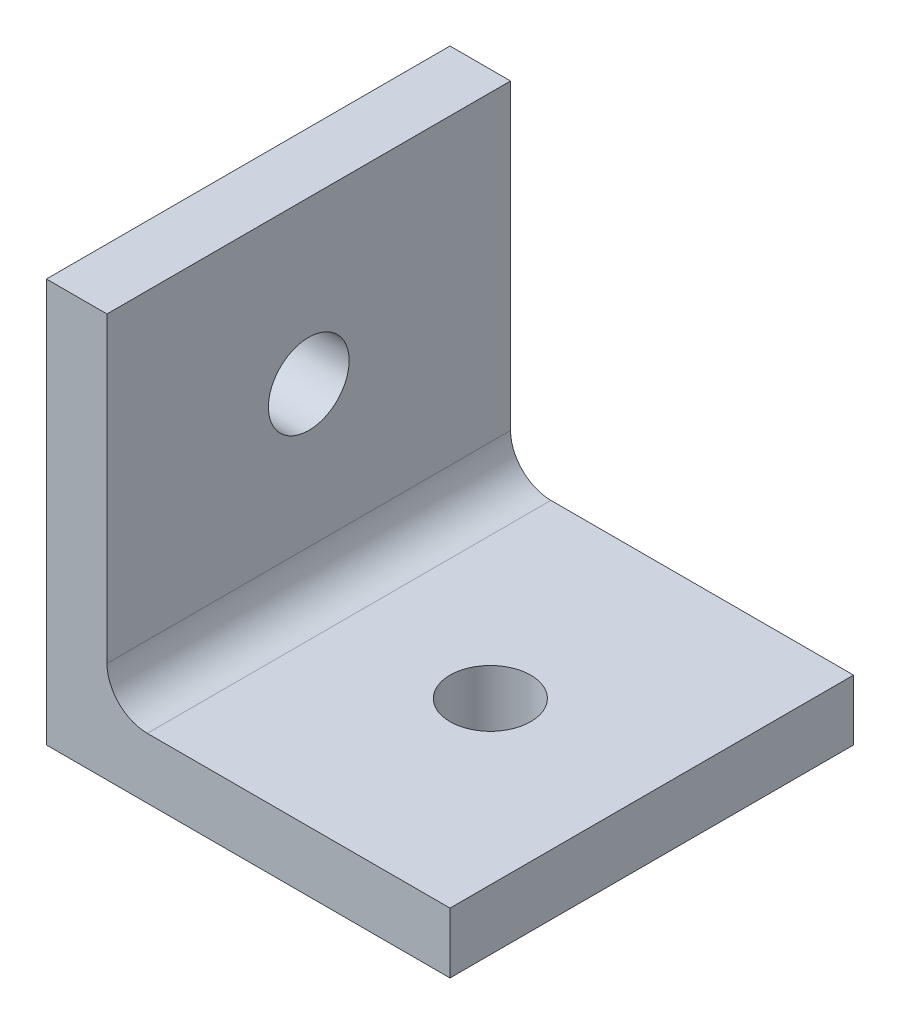
ISO-10303-21;
HEADER;
FILE_DESCRIPTION(('STEP AP214'),'2;1');
FILE_NAME('part.step','',(''),(''),'','','');
FILE_SCHEMA(('AUTOMOTIVE_DESIGN { 1 0 10303 214 1 1 1 1 }'));
ENDSEC;
DATA;
#1=APPLICATION_CONTEXT('core data for automotive mechanical design processes');
#2=APPLICATION_PROTOCOL_DEFINITION('international standard','automotive_design',2000,#1);
#3=PRODUCT_CONTEXT('',#1,'mechanical');
#4=PRODUCT('Part','Part','',(#3));
#5=PRODUCT_RELATED_PRODUCT_CATEGORY('part','',(#4));
#6=PRODUCT_DEFINITION_FORMATION('','',#4);
#7=PRODUCT_DEFINITION_CONTEXT('part definition',#1,'design');
#8=PRODUCT_DEFINITION('design','',#6,#7);
#9=PRODUCT_DEFINITION_SHAPE('','',#8);
#10=(LENGTH_UNIT() NAMED_UNIT(*) SI_UNIT(.MILLI.,.METRE.));
#11=(NAMED_UNIT(*) PLANE_ANGLE_UNIT() SI_UNIT($,.RADIAN.));
#12=(NAMED_UNIT(*) SI_UNIT($,.STERADIAN.) SOLID_ANGLE_UNIT());
#13=UNCERTAINTY_MEASURE_WITH_UNIT(LENGTH_MEASURE(1.E-05),#10,'distance_accuracy_value','');
#14=(GEOMETRIC_REPRESENTATION_CONTEXT(3) GLOBAL_UNCERTAINTY_ASSIGNED_CONTEXT((#13)) GLOBAL_UNIT_ASSIGNED_CONTEXT((#10,
#11,#12)) REPRESENTATION_CONTEXT('',''));
#15=CARTESIAN_POINT('',(0.,0.,0.));
#16=DIRECTION('',(0.,0.,1.));
#17=DIRECTION('',(1.,0.,0.));
#18=AXIS2_PLACEMENT_3D('',#15,#16,#17);
#19=CARTESIAN_POINT('',(0.,3.,20.));
#20=DIRECTION('',(0.,1.,0.));
#21=DIRECTION('',(-1.,0.,0.));
#22=AXIS2_PLACEMENT_3D('',#19,#20,#21);
#23=PLANE('',#22);
#24=CARTESIAN_POINT('',(12.,3.,10.));
#25=DIRECTION('',(0.,1.,0.));
#26=DIRECTION('',(0.,0.,1.));
#27=AXIS2_PLACEMENT_3D('',#24,#25,#26);
#28=CIRCLE('',#27,1.99999999999999);
#29=CARTESIAN_POINT('',(12.,3.,12.));
#30=VERTEX_POINT('',#29);
#31=EDGE_CURVE('E174',#30,#30,#28,.T.);
#32=ORIENTED_EDGE('',*,*,#31,.F.);
#33=EDGE_LOOP('',(#32));
#34=FACE_BOUND('',#33,.T.);
#35=DIRECTION('',(1.,0.,0.));
#36=VECTOR('',#35,1.);
#37=CARTESIAN_POINT('',(0.,3.,0.));
#38=LINE('',#37,#36);
#39=CARTESIAN_POINT('',(5.,3.,0.));
#40=VERTEX_POINT('',#39);
#41=CARTESIAN_POINT('',(20.,3.,0.));
#42=VERTEX_POINT('',#41);
#43=EDGE_CURVE('E127',#40,#42,#38,.T.);
#44=ORIENTED_EDGE('',*,*,#43,.F.);
#45=DIRECTION('',(0.,0.,-1.));
#46=VECTOR('',#45,1.);
#47=CARTESIAN_POINT('',(5.,3.,20.));
#48=LINE('',#47,#46);
#49=CARTESIAN_POINT('',(5.,3.,20.));
#50=VERTEX_POINT('',#49);
#51=EDGE_CURVE('E50',#40,#50,#48,.F.);
#52=ORIENTED_EDGE('',*,*,#51,.T.);
#53=DIRECTION('',(1.,0.,0.));
#54=VECTOR('',#53,1.);
#55=CARTESIAN_POINT('',(0.,3.,20.));
#56=LINE('',#55,#54);
#57=CARTESIAN_POINT('',(20.,3.,20.));
#58=VERTEX_POINT('',#57);
#59=EDGE_CURVE('E103',#50,#58,#56,.T.);
#60=ORIENTED_EDGE('',*,*,#59,.T.);
#61=DIRECTION('',(0.,0.,-1.));
#62=VECTOR('',#61,1.);
#63=CARTESIAN_POINT('',(20.,3.,20.));
#64=LINE('',#63,#62);
#65=EDGE_CURVE('E126',#58,#42,#64,.T.);
#66=ORIENTED_EDGE('',*,*,#65,.T.);
#67=EDGE_LOOP('',(#44,#52,#60,#66));
#68=FACE_BOUND('',#67,.T.);
#69=ADVANCED_FACE('F35',(#34,#68),#23,.T.);
#70=CARTESIAN_POINT('',(3.,0.,20.));
#71=DIRECTION('',(-1.,0.,0.));
#72=DIRECTION('',(0.,0.,1.));
#73=AXIS2_PLACEMENT_3D('',#70,#71,#72);
#74=PLANE('',#73);
#75=CARTESIAN_POINT('',(3.,12.,10.));
#76=DIRECTION('',(1.,0.,0.));
#77=DIRECTION('',(0.,0.,-1.));
#78=AXIS2_PLACEMENT_3D('',#75,#76,#77);
#79=CIRCLE('',#78,2.);
#80=CARTESIAN_POINT('',(3.,12.,8.));
#81=VERTEX_POINT('',#80);
#82=EDGE_CURVE('E168',#81,#81,#79,.T.);
#83=ORIENTED_EDGE('',*,*,#82,.F.);
#84=EDGE_LOOP('',(#83));
#85=FACE_BOUND('',#84,.T.);
#86=DIRECTION('',(0.,1.,0.));
#87=VECTOR('',#86,1.);
#88=CARTESIAN_POINT('',(3.,0.,20.));
#89=LINE('',#88,#87);
#90=CARTESIAN_POINT('',(3.,5.,20.));
#91=VERTEX_POINT('',#90);
#92=CARTESIAN_POINT('',(3.,20.,20.));
#93=VERTEX_POINT('',#92);
#94=EDGE_CURVE('E92',#91,#93,#89,.T.);
#95=ORIENTED_EDGE('',*,*,#94,.F.);
#96=DIRECTION('',(0.,0.,-1.));
#97=VECTOR('',#96,1.);
#98=CARTESIAN_POINT('',(3.,5.,20.));
#99=LINE('',#98,#97);
#100=CARTESIAN_POINT('',(3.,5.,0.));
#101=VERTEX_POINT('',#100);
#102=EDGE_CURVE('E112',#91,#101,#99,.T.);
#103=ORIENTED_EDGE('',*,*,#102,.T.);
#104=DIRECTION('',(0.,1.,0.));
#105=VECTOR('',#104,1.);
#106=CARTESIAN_POINT('',(3.,0.,0.));
#107=LINE('',#106,#105);
#108=CARTESIAN_POINT('',(3.,20.,0.));
#109=VERTEX_POINT('',#108);
#110=EDGE_CURVE('E108',#101,#109,#107,.T.);
#111=ORIENTED_EDGE('',*,*,#110,.T.);
#112=DIRECTION('',(0.,0.,-1.));
#113=VECTOR('',#112,1.);
#114=CARTESIAN_POINT('',(3.,20.,20.));
#115=LINE('',#114,#113);
#116=EDGE_CURVE('E106',#93,#109,#115,.T.);
#117=ORIENTED_EDGE('',*,*,#116,.F.);
#118=EDGE_LOOP('',(#95,#103,#111,#117));
#119=FACE_BOUND('',#118,.T.);
#120=ADVANCED_FACE('F107',(#85,#119),#74,.F.);
#121=CARTESIAN_POINT('',(0.,20.,20.));
#122=DIRECTION('',(0.,1.,0.));
#123=DIRECTION('',(0.,0.,1.));
#124=AXIS2_PLACEMENT_3D('',#121,#122,#123);
#125=PLANE('',#124);
#126=DIRECTION('',(1.,0.,0.));
#127=VECTOR('',#126,1.);
#128=CARTESIAN_POINT('',(0.,20.,0.));
#129=LINE('',#128,#127);
#130=CARTESIAN_POINT('',(0.,20.,0.));
#131=VERTEX_POINT('',#130);
#132=EDGE_CURVE('E131',#131,#109,#129,.T.);
#133=ORIENTED_EDGE('',*,*,#132,.F.);
#134=DIRECTION('',(0.,0.,-1.));
#135=VECTOR('',#134,1.);
#136=CARTESIAN_POINT('',(0.,20.,20.));
#137=LINE('',#136,#135);
#138=CARTESIAN_POINT('',(0.,20.,20.));
#139=VERTEX_POINT('',#138);
#140=EDGE_CURVE('E113',#139,#131,#137,.T.);
#141=ORIENTED_EDGE('',*,*,#140,.F.);
#142=DIRECTION('',(1.,0.,0.));
#143=VECTOR('',#142,1.);
#144=CARTESIAN_POINT('',(0.,20.,20.));
#145=LINE('',#144,#143);
#146=EDGE_CURVE('E97',#139,#93,#145,.T.);
#147=ORIENTED_EDGE('',*,*,#146,.T.);
#148=ORIENTED_EDGE('',*,*,#116,.T.);
#149=EDGE_LOOP('',(#133,#141,#147,#148));
#150=FACE_BOUND('',#149,.T.);
#151=ADVANCED_FACE('F115',(#150),#125,.T.);
#152=CARTESIAN_POINT('',(0.,0.,20.));
#153=DIRECTION('',(-1.,0.,0.));
#154=DIRECTION('',(0.,0.,1.));
#155=AXIS2_PLACEMENT_3D('',#152,#153,#154);
#156=PLANE('',#155);
#157=CARTESIAN_POINT('',(0.,12.,10.));
#158=DIRECTION('',(1.,0.,0.));
#159=DIRECTION('',(0.,0.,-1.));
#160=AXIS2_PLACEMENT_3D('',#157,#158,#159);
#161=CIRCLE('',#160,2.);
#162=CARTESIAN_POINT('',(0.,12.,8.));
#163=VERTEX_POINT('',#162);
#164=EDGE_CURVE('E129',#163,#163,#161,.T.);
#165=ORIENTED_EDGE('',*,*,#164,.T.);
#166=EDGE_LOOP('',(#165));
#167=FACE_BOUND('',#166,.T.);
#168=DIRECTION('',(0.,1.,0.));
#169=VECTOR('',#168,1.);
#170=CARTESIAN_POINT('',(0.,0.,0.));
#171=LINE('',#170,#169);
#172=CARTESIAN_POINT('',(0.,0.,0.));
#173=VERTEX_POINT('',#172);
#174=EDGE_CURVE('E133',#173,#131,#171,.T.);
#175=ORIENTED_EDGE('',*,*,#174,.F.);
#176=DIRECTION('',(0.,0.,-1.));
#177=VECTOR('',#176,1.);
#178=CARTESIAN_POINT('',(0.,0.,20.));
#179=LINE('',#178,#177);
#180=CARTESIAN_POINT('',(0.,0.,20.));
#181=VERTEX_POINT('',#180);
#182=EDGE_CURVE('E146',#181,#173,#179,.T.);
#183=ORIENTED_EDGE('',*,*,#182,.F.);
#184=DIRECTION('',(0.,1.,0.));
#185=VECTOR('',#184,1.);
#186=CARTESIAN_POINT('',(0.,0.,20.));
#187=LINE('',#186,#185);
#188=EDGE_CURVE('E116',#181,#139,#187,.T.);
#189=ORIENTED_EDGE('',*,*,#188,.T.);
#190=ORIENTED_EDGE('',*,*,#140,.T.);
#191=EDGE_LOOP('',(#175,#183,#189,#190));
#192=FACE_BOUND('',#191,.T.);
#193=ADVANCED_FACE('F156',(#167,#192),#156,.T.);
#194=CARTESIAN_POINT('',(0.,0.,20.));
#195=DIRECTION('',(0.,1.,0.));
#196=DIRECTION('',(0.,0.,1.));
#197=AXIS2_PLACEMENT_3D('',#194,#195,#196);
#198=PLANE('',#197);
#199=CARTESIAN_POINT('',(12.,0.,10.));
#200=DIRECTION('',(0.,1.,0.));
#201=DIRECTION('',(0.,0.,1.));
#202=AXIS2_PLACEMENT_3D('',#199,#200,#201);
#203=CIRCLE('',#202,2.);
#204=CARTESIAN_POINT('',(12.,0.,12.));
#205=VERTEX_POINT('',#204);
#206=EDGE_CURVE('E171',#205,#205,#203,.T.);
#207=ORIENTED_EDGE('',*,*,#206,.T.);
#208=EDGE_LOOP('',(#207));
#209=FACE_BOUND('',#208,.T.);
#210=DIRECTION('',(1.,0.,0.));
#211=VECTOR('',#210,1.);
#212=CARTESIAN_POINT('',(0.,0.,0.));
#213=LINE('',#212,#211);
#214=CARTESIAN_POINT('',(20.,0.,0.));
#215=VERTEX_POINT('',#214);
#216=EDGE_CURVE('E136',#173,#215,#213,.T.);
#217=ORIENTED_EDGE('',*,*,#216,.T.);
#218=DIRECTION('',(0.,0.,-1.));
#219=VECTOR('',#218,1.);
#220=CARTESIAN_POINT('',(20.,0.,20.));
#221=LINE('',#220,#219);
#222=CARTESIAN_POINT('',(20.,0.,20.));
#223=VERTEX_POINT('',#222);
#224=EDGE_CURVE('E143',#223,#215,#221,.T.);
#225=ORIENTED_EDGE('',*,*,#224,.F.);
#226=DIRECTION('',(1.,0.,0.));
#227=VECTOR('',#226,1.);
#228=CARTESIAN_POINT('',(0.,0.,20.));
#229=LINE('',#228,#227);
#230=EDGE_CURVE('E118',#181,#223,#229,.T.);
#231=ORIENTED_EDGE('',*,*,#230,.F.);
#232=ORIENTED_EDGE('',*,*,#182,.T.);
#233=EDGE_LOOP('',(#217,#225,#231,#232));
#234=FACE_BOUND('',#233,.T.);
#235=ADVANCED_FACE('F162',(#209,#234),#198,.F.);
#236=CARTESIAN_POINT('',(20.,0.,20.));
#237=DIRECTION('',(-1.,0.,0.));
#238=DIRECTION('',(0.,0.,1.));
#239=AXIS2_PLACEMENT_3D('',#236,#237,#238);
#240=PLANE('',#239);
#241=DIRECTION('',(0.,1.,0.));
#242=VECTOR('',#241,1.);
#243=CARTESIAN_POINT('',(20.,0.,0.));
#244=LINE('',#243,#242);
#245=EDGE_CURVE('E138',#215,#42,#244,.T.);
#246=ORIENTED_EDGE('',*,*,#245,.T.);
#247=ORIENTED_EDGE('',*,*,#65,.F.);
#248=DIRECTION('',(0.,1.,0.));
#249=VECTOR('',#248,1.);
#250=CARTESIAN_POINT('',(20.,0.,20.));
#251=LINE('',#250,#249);
#252=EDGE_CURVE('E123',#223,#58,#251,.T.);
#253=ORIENTED_EDGE('',*,*,#252,.F.);
#254=ORIENTED_EDGE('',*,*,#224,.T.);
#255=EDGE_LOOP('',(#246,#247,#253,#254));
#256=FACE_BOUND('',#255,.T.);
#257=ADVANCED_FACE('F164',(#256),#240,.F.);
#258=CARTESIAN_POINT('',(0.,0.,20.));
#259=DIRECTION('',(0.,0.,1.));
#260=DIRECTION('',(1.,0.,0.));
#261=AXIS2_PLACEMENT_3D('',#258,#259,#260);
#262=PLANE('',#261);
#263=ORIENTED_EDGE('',*,*,#59,.F.);
#264=CARTESIAN_POINT('',(5.,5.,20.));
#265=DIRECTION('',(0.,0.,1.));
#266=DIRECTION('',(1.,0.,0.));
#267=AXIS2_PLACEMENT_3D('',#264,#265,#266);
#268=CIRCLE('',#267,2.);
#269=EDGE_CURVE('E11',#50,#91,#268,.F.);
#270=ORIENTED_EDGE('',*,*,#269,.T.);
#271=ORIENTED_EDGE('',*,*,#94,.T.);
#272=ORIENTED_EDGE('',*,*,#146,.F.);
#273=ORIENTED_EDGE('',*,*,#188,.F.);
#274=ORIENTED_EDGE('',*,*,#230,.T.);
#275=ORIENTED_EDGE('',*,*,#252,.T.);
#276=EDGE_LOOP('',(#263,#270,#271,#272,#273,#274,#275));
#277=FACE_BOUND('',#276,.T.);
#278=ADVANCED_FACE('F94',(#277),#262,.T.);
#279=CARTESIAN_POINT('',(0.,0.,0.));
#280=DIRECTION('',(0.,0.,1.));
#281=DIRECTION('',(1.,0.,0.));
#282=AXIS2_PLACEMENT_3D('',#279,#280,#281);
#283=PLANE('',#282);
#284=ORIENTED_EDGE('',*,*,#110,.F.);
#285=CARTESIAN_POINT('',(5.,5.,0.));
#286=DIRECTION('',(0.,0.,1.));
#287=DIRECTION('',(1.,0.,0.));
#288=AXIS2_PLACEMENT_3D('',#285,#286,#287);
#289=CIRCLE('',#288,2.);
#290=EDGE_CURVE('E43',#101,#40,#289,.T.);
#291=ORIENTED_EDGE('',*,*,#290,.T.);
#292=ORIENTED_EDGE('',*,*,#43,.T.);
#293=ORIENTED_EDGE('',*,*,#245,.F.);
#294=ORIENTED_EDGE('',*,*,#216,.F.);
#295=ORIENTED_EDGE('',*,*,#174,.T.);
#296=ORIENTED_EDGE('',*,*,#132,.T.);
#297=EDGE_LOOP('',(#284,#291,#292,#293,#294,#295,#296));
#298=FACE_BOUND('',#297,.T.);
#299=ADVANCED_FACE('F151',(#298),#283,.F.);
#300=CARTESIAN_POINT('',(5.,5.,20.));
#301=DIRECTION('',(0.,0.,-1.));
#302=DIRECTION('',(-1.,0.,0.));
#303=AXIS2_PLACEMENT_3D('',#300,#301,#302);
#304=CYLINDRICAL_SURFACE('',#303,2.);
#305=ORIENTED_EDGE('',*,*,#269,.F.);
#306=ORIENTED_EDGE('',*,*,#51,.F.);
#307=ORIENTED_EDGE('',*,*,#290,.F.);
#308=ORIENTED_EDGE('',*,*,#102,.F.);
#309=EDGE_LOOP('',(#305,#306,#307,#308));
#310=FACE_BOUND('',#309,.T.);
#311=ADVANCED_FACE('F37',(#310),#304,.F.);
#312=CARTESIAN_POINT('',(3.,12.,10.));
#313=DIRECTION('',(1.,0.,0.));
#314=DIRECTION('',(0.,0.,-1.));
#315=AXIS2_PLACEMENT_3D('',#312,#313,#314);
#316=CYLINDRICAL_SURFACE('',#315,2.);
#317=ORIENTED_EDGE('',*,*,#164,.F.);
#318=EDGE_LOOP('',(#317));
#319=FACE_BOUND('',#318,.T.);
#320=ORIENTED_EDGE('',*,*,#82,.T.);
#321=EDGE_LOOP('',(#320));
#322=FACE_BOUND('',#321,.T.);
#323=ADVANCED_FACE('F201',(#319,#322),#316,.F.);
#324=CARTESIAN_POINT('',(12.,3.,10.));
#325=DIRECTION('',(0.,1.,0.));
#326=DIRECTION('',(0.,0.,1.));
#327=AXIS2_PLACEMENT_3D('',#324,#325,#326);
#328=CYLINDRICAL_SURFACE('',#327,1.99999999999999);
#329=ORIENTED_EDGE('',*,*,#206,.F.);
#330=EDGE_LOOP('',(#329));
#331=FACE_BOUND('',#330,.T.);
#332=ORIENTED_EDGE('',*,*,#31,.T.);
#333=EDGE_LOOP('',(#332));
#334=FACE_BOUND('',#333,.T.);
#335=ADVANCED_FACE('F178',(#331,#334),#328,.F.);
#336=CLOSED_SHELL('',(#69,#120,#151,#193,#235,#257,#278,#299,#311,#323,#335));
#337=MANIFOLD_SOLID_BREP('B2',#336);
#338=ADVANCED_BREP_SHAPE_REPRESENTATION('',(#18,#337),#14);
#339=SHAPE_DEFINITION_REPRESENTATION(#9,#338);
ENDSEC;
END-ISO-10303-21;
